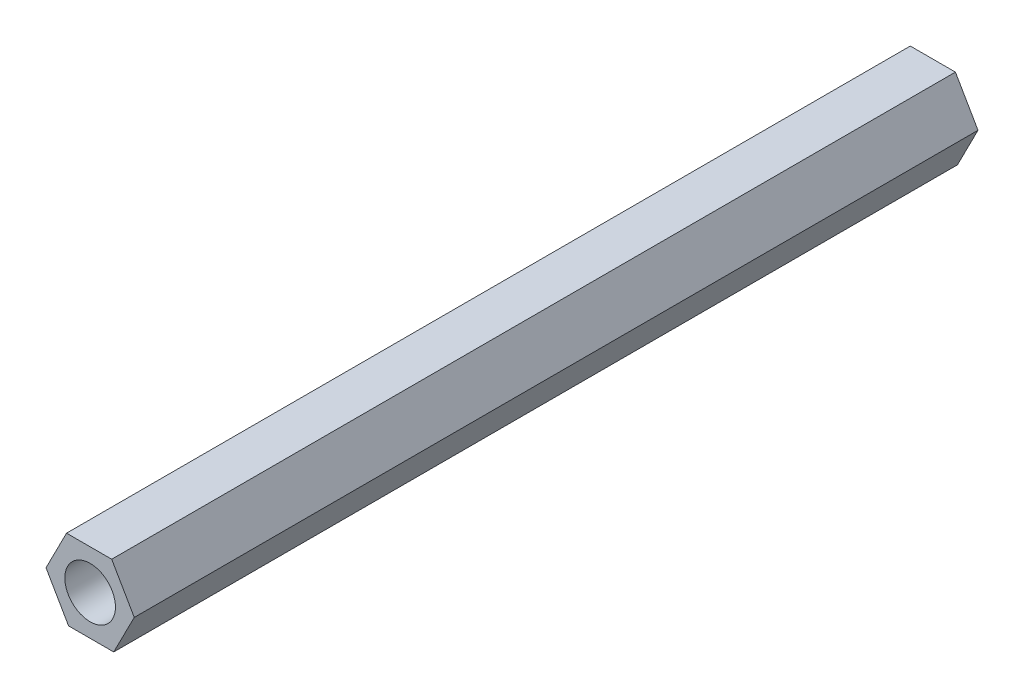
ISO-10303-21;
HEADER;
FILE_DESCRIPTION(('STEP AP214'),'2;1');
FILE_NAME('part.step','',(''),(''),'','','');
FILE_SCHEMA(('AUTOMOTIVE_DESIGN { 1 0 10303 214 1 1 1 1 }'));
ENDSEC;
DATA;
#1=APPLICATION_CONTEXT('core data for automotive mechanical design processes');
#2=APPLICATION_PROTOCOL_DEFINITION('international standard','automotive_design',2000,#1);
#3=PRODUCT_CONTEXT('',#1,'mechanical');
#4=PRODUCT('Part','Part','',(#3));
#5=PRODUCT_RELATED_PRODUCT_CATEGORY('part','',(#4));
#6=PRODUCT_DEFINITION_FORMATION('','',#4);
#7=PRODUCT_DEFINITION_CONTEXT('part definition',#1,'design');
#8=PRODUCT_DEFINITION('design','',#6,#7);
#9=PRODUCT_DEFINITION_SHAPE('','',#8);
#10=(LENGTH_UNIT() NAMED_UNIT(*) SI_UNIT(.MILLI.,.METRE.));
#11=(NAMED_UNIT(*) PLANE_ANGLE_UNIT() SI_UNIT($,.RADIAN.));
#12=(NAMED_UNIT(*) SI_UNIT($,.STERADIAN.) SOLID_ANGLE_UNIT());
#13=UNCERTAINTY_MEASURE_WITH_UNIT(LENGTH_MEASURE(1.E-05),#10,'distance_accuracy_value','');
#14=(GEOMETRIC_REPRESENTATION_CONTEXT(3) GLOBAL_UNCERTAINTY_ASSIGNED_CONTEXT((#13)) GLOBAL_UNIT_ASSIGNED_CONTEXT((#10,
#11,#12)) REPRESENTATION_CONTEXT('',''));
#15=CARTESIAN_POINT('',(0.,0.,0.));
#16=DIRECTION('',(0.,0.,1.));
#17=DIRECTION('',(1.,0.,0.));
#18=AXIS2_PLACEMENT_3D('',#15,#16,#17);
#19=CARTESIAN_POINT('',(2.67571891142525,0.,50.));
#20=DIRECTION('',(-0.86602540378444,-0.499999999999998,0.));
#21=DIRECTION('',(0.499999999999998,-0.86602540378444,0.));
#22=AXIS2_PLACEMENT_3D('',#19,#20,#21);
#23=PLANE('',#22);
#24=DIRECTION('',(-0.499999999999998,0.86602540378444,0.));
#25=VECTOR('',#24,1.);
#26=CARTESIAN_POINT('',(2.67571891142525,0.,0.));
#27=LINE('',#26,#25);
#28=CARTESIAN_POINT('',(4.01357836713789,-2.3172405506807,0.));
#29=VERTEX_POINT('',#28);
#30=CARTESIAN_POINT('',(2.67571891142525,0.,0.));
#31=VERTEX_POINT('',#30);
#32=EDGE_CURVE('E125',#29,#31,#27,.T.);
#33=ORIENTED_EDGE('',*,*,#32,.T.);
#34=DIRECTION('',(0.,0.,-1.));
#35=VECTOR('',#34,1.);
#36=CARTESIAN_POINT('',(2.67571891142525,0.,50.));
#37=LINE('',#36,#35);
#38=CARTESIAN_POINT('',(2.67571891142525,0.,50.));
#39=VERTEX_POINT('',#38);
#40=EDGE_CURVE('E11',#39,#31,#37,.T.);
#41=ORIENTED_EDGE('',*,*,#40,.F.);
#42=DIRECTION('',(-0.499999999999998,0.86602540378444,0.));
#43=VECTOR('',#42,1.);
#44=CARTESIAN_POINT('',(2.67571891142525,0.,50.));
#45=LINE('',#44,#43);
#46=CARTESIAN_POINT('',(4.01357836713789,-2.3172405506807,50.));
#47=VERTEX_POINT('',#46);
#48=EDGE_CURVE('E136',#47,#39,#45,.T.);
#49=ORIENTED_EDGE('',*,*,#48,.F.);
#50=DIRECTION('',(0.,0.,-1.));
#51=VECTOR('',#50,1.);
#52=CARTESIAN_POINT('',(4.01357836713789,-2.3172405506807,50.));
#53=LINE('',#52,#51);
#54=EDGE_CURVE('E121',#47,#29,#53,.T.);
#55=ORIENTED_EDGE('',*,*,#54,.T.);
#56=EDGE_LOOP('',(#33,#41,#49,#55));
#57=FACE_BOUND('',#56,.T.);
#58=ADVANCED_FACE('F41',(#57),#23,.F.);
#59=CARTESIAN_POINT('',(0.,0.,50.));
#60=DIRECTION('',(0.,-1.,0.));
#61=DIRECTION('',(0.,0.,-1.));
#62=AXIS2_PLACEMENT_3D('',#59,#60,#61);
#63=PLANE('',#62);
#64=DIRECTION('',(-1.,0.,0.));
#65=VECTOR('',#64,1.);
#66=CARTESIAN_POINT('',(0.,0.,0.));
#67=LINE('',#66,#65);
#68=CARTESIAN_POINT('',(0.,0.,0.));
#69=VERTEX_POINT('',#68);
#70=EDGE_CURVE('E128',#31,#69,#67,.T.);
#71=ORIENTED_EDGE('',*,*,#70,.T.);
#72=DIRECTION('',(0.,0.,-1.));
#73=VECTOR('',#72,1.);
#74=CARTESIAN_POINT('',(0.,0.,50.));
#75=LINE('',#74,#73);
#76=CARTESIAN_POINT('',(0.,0.,50.));
#77=VERTEX_POINT('',#76);
#78=EDGE_CURVE('E49',#77,#69,#75,.T.);
#79=ORIENTED_EDGE('',*,*,#78,.F.);
#80=DIRECTION('',(-1.,0.,0.));
#81=VECTOR('',#80,1.);
#82=CARTESIAN_POINT('',(0.,0.,50.));
#83=LINE('',#82,#81);
#84=EDGE_CURVE('E94',#39,#77,#83,.T.);
#85=ORIENTED_EDGE('',*,*,#84,.F.);
#86=ORIENTED_EDGE('',*,*,#40,.T.);
#87=EDGE_LOOP('',(#71,#79,#85,#86));
#88=FACE_BOUND('',#87,.T.);
#89=ADVANCED_FACE('F161',(#88),#63,.F.);
#90=CARTESIAN_POINT('',(-1.21734510293459,-2.38275944931921,50.));
#91=DIRECTION('',(0.890511869219483,-0.454960010087944,0.));
#92=DIRECTION('',(0.454960010087944,0.890511869219483,0.));
#93=AXIS2_PLACEMENT_3D('',#90,#91,#92);
#94=PLANE('',#93);
#95=DIRECTION('',(-0.454960010087944,-0.890511869219483,0.));
#96=VECTOR('',#95,1.);
#97=CARTESIAN_POINT('',(-1.21734510293459,-2.38275944931921,0.));
#98=LINE('',#97,#96);
#99=CARTESIAN_POINT('',(-1.21734510293459,-2.38275944931921,0.));
#100=VERTEX_POINT('',#99);
#101=EDGE_CURVE('E131',#69,#100,#98,.T.);
#102=ORIENTED_EDGE('',*,*,#101,.T.);
#103=DIRECTION('',(0.,0.,-1.));
#104=VECTOR('',#103,1.);
#105=CARTESIAN_POINT('',(-1.21734510293459,-2.38275944931921,50.));
#106=LINE('',#105,#104);
#107=CARTESIAN_POINT('',(-1.21734510293459,-2.38275944931921,50.));
#108=VERTEX_POINT('',#107);
#109=EDGE_CURVE('E116',#108,#100,#106,.T.);
#110=ORIENTED_EDGE('',*,*,#109,.F.);
#111=DIRECTION('',(-0.454960010087944,-0.890511869219483,0.));
#112=VECTOR('',#111,1.);
#113=CARTESIAN_POINT('',(-1.21734510293459,-2.38275944931921,50.));
#114=LINE('',#113,#112);
#115=EDGE_CURVE('E107',#77,#108,#114,.T.);
#116=ORIENTED_EDGE('',*,*,#115,.F.);
#117=ORIENTED_EDGE('',*,*,#78,.T.);
#118=EDGE_LOOP('',(#102,#110,#116,#117));
#119=FACE_BOUND('',#118,.T.);
#120=ADVANCED_FACE('F142',(#119),#94,.F.);
#121=CARTESIAN_POINT('',(0.120514352778052,-4.69999999999995,50.));
#122=DIRECTION('',(0.86602540378444,0.499999999999998,0.));
#123=DIRECTION('',(-0.499999999999998,0.86602540378444,0.));
#124=AXIS2_PLACEMENT_3D('',#121,#122,#123);
#125=PLANE('',#124);
#126=DIRECTION('',(0.499999999999998,-0.86602540378444,0.));
#127=VECTOR('',#126,1.);
#128=CARTESIAN_POINT('',(0.120514352778052,-4.69999999999995,0.));
#129=LINE('',#128,#127);
#130=CARTESIAN_POINT('',(0.120514352778052,-4.69999999999995,0.));
#131=VERTEX_POINT('',#130);
#132=EDGE_CURVE('E115',#100,#131,#129,.T.);
#133=ORIENTED_EDGE('',*,*,#132,.T.);
#134=DIRECTION('',(0.,0.,-1.));
#135=VECTOR('',#134,1.);
#136=CARTESIAN_POINT('',(0.120514352778052,-4.69999999999995,50.));
#137=LINE('',#136,#135);
#138=CARTESIAN_POINT('',(0.120514352778052,-4.69999999999995,50.));
#139=VERTEX_POINT('',#138);
#140=EDGE_CURVE('E112',#139,#131,#137,.T.);
#141=ORIENTED_EDGE('',*,*,#140,.F.);
#142=DIRECTION('',(0.499999999999998,-0.86602540378444,0.));
#143=VECTOR('',#142,1.);
#144=CARTESIAN_POINT('',(0.120514352778052,-4.69999999999995,50.));
#145=LINE('',#144,#143);
#146=EDGE_CURVE('E101',#108,#139,#145,.T.);
#147=ORIENTED_EDGE('',*,*,#146,.F.);
#148=ORIENTED_EDGE('',*,*,#109,.T.);
#149=EDGE_LOOP('',(#133,#141,#147,#148));
#150=FACE_BOUND('',#149,.T.);
#151=ADVANCED_FACE('F113',(#150),#125,.F.);
#152=CARTESIAN_POINT('',(2.79623326420334,-4.69999999999995,50.));
#153=DIRECTION('',(0.,1.,0.));
#154=DIRECTION('',(0.,0.,1.));
#155=AXIS2_PLACEMENT_3D('',#152,#153,#154);
#156=PLANE('',#155);
#157=DIRECTION('',(1.,0.,0.));
#158=VECTOR('',#157,1.);
#159=CARTESIAN_POINT('',(2.79623326420334,-4.69999999999995,0.));
#160=LINE('',#159,#158);
#161=CARTESIAN_POINT('',(2.79623326420334,-4.69999999999995,0.));
#162=VERTEX_POINT('',#161);
#163=EDGE_CURVE('E80',#131,#162,#160,.T.);
#164=ORIENTED_EDGE('',*,*,#163,.T.);
#165=DIRECTION('',(0.,0.,-1.));
#166=VECTOR('',#165,1.);
#167=CARTESIAN_POINT('',(2.79623326420334,-4.69999999999995,50.));
#168=LINE('',#167,#166);
#169=CARTESIAN_POINT('',(2.79623326420334,-4.69999999999995,50.));
#170=VERTEX_POINT('',#169);
#171=EDGE_CURVE('E117',#170,#162,#168,.T.);
#172=ORIENTED_EDGE('',*,*,#171,.F.);
#173=DIRECTION('',(1.,0.,0.));
#174=VECTOR('',#173,1.);
#175=CARTESIAN_POINT('',(2.79623326420334,-4.69999999999995,50.));
#176=LINE('',#175,#174);
#177=EDGE_CURVE('E105',#139,#170,#176,.T.);
#178=ORIENTED_EDGE('',*,*,#177,.F.);
#179=ORIENTED_EDGE('',*,*,#140,.T.);
#180=EDGE_LOOP('',(#164,#172,#178,#179));
#181=FACE_BOUND('',#180,.T.);
#182=ADVANCED_FACE('F119',(#181),#156,.F.);
#183=CARTESIAN_POINT('',(4.01357836713789,-2.3172405506807,50.));
#184=DIRECTION('',(-0.890511869219483,0.454960010087944,0.));
#185=DIRECTION('',(-0.454960010087944,-0.890511869219483,0.));
#186=AXIS2_PLACEMENT_3D('',#183,#184,#185);
#187=PLANE('',#186);
#188=DIRECTION('',(0.454960010087944,0.890511869219483,0.));
#189=VECTOR('',#188,1.);
#190=CARTESIAN_POINT('',(4.01357836713789,-2.3172405506807,0.));
#191=LINE('',#190,#189);
#192=EDGE_CURVE('E86',#162,#29,#191,.T.);
#193=ORIENTED_EDGE('',*,*,#192,.T.);
#194=ORIENTED_EDGE('',*,*,#54,.F.);
#195=DIRECTION('',(0.454960010087944,0.890511869219483,0.));
#196=VECTOR('',#195,1.);
#197=CARTESIAN_POINT('',(4.01357836713789,-2.3172405506807,50.));
#198=LINE('',#197,#196);
#199=EDGE_CURVE('E57',#170,#47,#198,.T.);
#200=ORIENTED_EDGE('',*,*,#199,.F.);
#201=ORIENTED_EDGE('',*,*,#171,.T.);
#202=EDGE_LOOP('',(#193,#194,#200,#201));
#203=FACE_BOUND('',#202,.T.);
#204=ADVANCED_FACE('F149',(#203),#187,.F.);
#205=CARTESIAN_POINT('',(0.,0.,50.));
#206=DIRECTION('',(0.,0.,-1.));
#207=DIRECTION('',(-1.,0.,0.));
#208=AXIS2_PLACEMENT_3D('',#205,#206,#207);
#209=PLANE('',#208);
#210=CARTESIAN_POINT('',(1.39811663210165,-2.34999999999995,50.));
#211=DIRECTION('',(0.,0.,1.));
#212=DIRECTION('',(1.,0.,0.));
#213=AXIS2_PLACEMENT_3D('',#210,#211,#212);
#214=CIRCLE('',#213,1.5);
#215=CARTESIAN_POINT('',(2.89811663210165,-2.34999999999995,50.));
#216=VERTEX_POINT('',#215);
#217=EDGE_CURVE('E129',#216,#216,#214,.T.);
#218=ORIENTED_EDGE('',*,*,#217,.F.);
#219=EDGE_LOOP('',(#218));
#220=FACE_BOUND('',#219,.T.);
#221=ORIENTED_EDGE('',*,*,#48,.T.);
#222=ORIENTED_EDGE('',*,*,#84,.T.);
#223=ORIENTED_EDGE('',*,*,#115,.T.);
#224=ORIENTED_EDGE('',*,*,#146,.T.);
#225=ORIENTED_EDGE('',*,*,#177,.T.);
#226=ORIENTED_EDGE('',*,*,#199,.T.);
#227=EDGE_LOOP('',(#221,#222,#223,#224,#225,#226));
#228=FACE_BOUND('',#227,.T.);
#229=ADVANCED_FACE('F103',(#220,#228),#209,.F.);
#230=CARTESIAN_POINT('',(0.,0.,0.));
#231=DIRECTION('',(0.,0.,-1.));
#232=DIRECTION('',(-1.,0.,0.));
#233=AXIS2_PLACEMENT_3D('',#230,#231,#232);
#234=PLANE('',#233);
#235=CARTESIAN_POINT('',(1.39811663210165,-2.34999999999995,0.));
#236=DIRECTION('',(0.,0.,1.));
#237=DIRECTION('',(1.,0.,0.));
#238=AXIS2_PLACEMENT_3D('',#235,#236,#237);
#239=CIRCLE('',#238,1.5);
#240=CARTESIAN_POINT('',(2.89811663210165,-2.34999999999995,0.));
#241=VERTEX_POINT('',#240);
#242=EDGE_CURVE('E221',#241,#241,#239,.T.);
#243=ORIENTED_EDGE('',*,*,#242,.T.);
#244=EDGE_LOOP('',(#243));
#245=FACE_BOUND('',#244,.T.);
#246=ORIENTED_EDGE('',*,*,#32,.F.);
#247=ORIENTED_EDGE('',*,*,#192,.F.);
#248=ORIENTED_EDGE('',*,*,#163,.F.);
#249=ORIENTED_EDGE('',*,*,#132,.F.);
#250=ORIENTED_EDGE('',*,*,#101,.F.);
#251=ORIENTED_EDGE('',*,*,#70,.F.);
#252=EDGE_LOOP('',(#246,#247,#248,#249,#250,#251));
#253=FACE_BOUND('',#252,.T.);
#254=ADVANCED_FACE('F145',(#245,#253),#234,.T.);
#255=CARTESIAN_POINT('',(1.39811663210165,-2.34999999999995,50.));
#256=DIRECTION('',(0.,0.,-1.));
#257=DIRECTION('',(-1.,0.,0.));
#258=AXIS2_PLACEMENT_3D('',#255,#256,#257);
#259=CYLINDRICAL_SURFACE('',#258,1.5);
#260=ORIENTED_EDGE('',*,*,#217,.T.);
#261=EDGE_LOOP('',(#260));
#262=FACE_BOUND('',#261,.T.);
#263=ORIENTED_EDGE('',*,*,#242,.F.);
#264=EDGE_LOOP('',(#263));
#265=FACE_BOUND('',#264,.T.);
#266=ADVANCED_FACE('F200',(#262,#265),#259,.F.);
#267=CLOSED_SHELL('',(#58,#89,#120,#151,#182,#204,#229,#254,#266));
#268=MANIFOLD_SOLID_BREP('B2',#267);
#269=ADVANCED_BREP_SHAPE_REPRESENTATION('',(#18,#268),#14);
#270=SHAPE_DEFINITION_REPRESENTATION(#9,#269);
ENDSEC;
END-ISO-10303-21;
